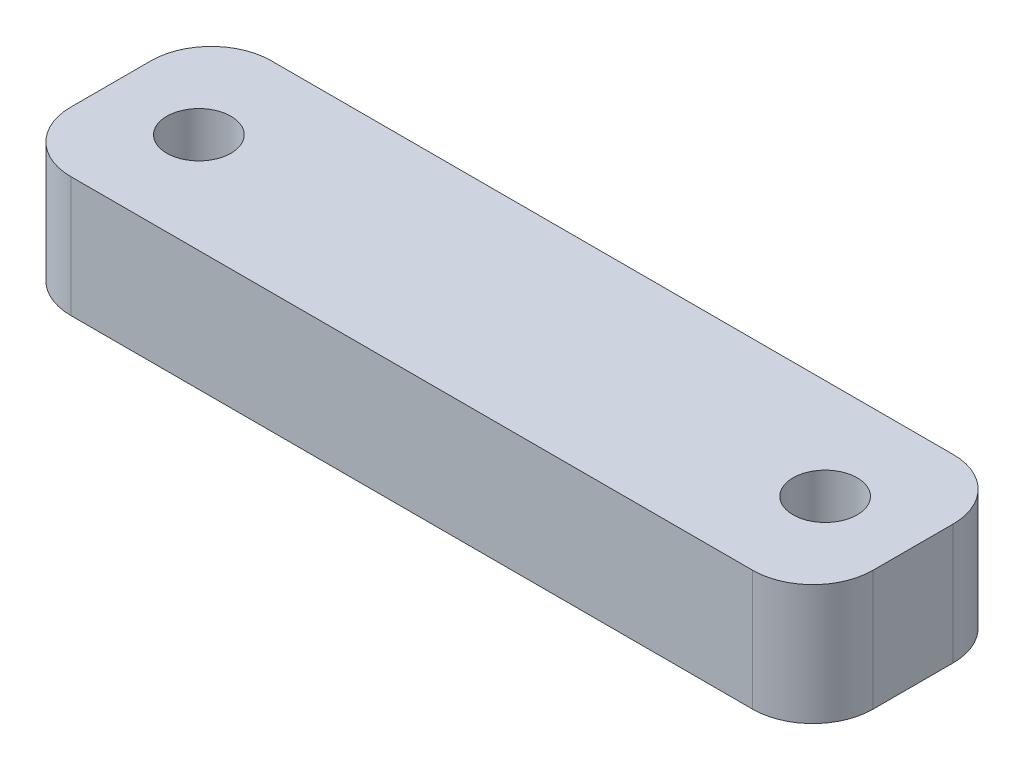
ISO-10303-21;
HEADER;
FILE_DESCRIPTION(('STEP AP214'),'2;1');
FILE_NAME('part.step','',(''),(''),'','','');
FILE_SCHEMA(('AUTOMOTIVE_DESIGN { 1 0 10303 214 1 1 1 1 }'));
ENDSEC;
DATA;
#1=APPLICATION_CONTEXT('core data for automotive mechanical design processes');
#2=APPLICATION_PROTOCOL_DEFINITION('international standard','automotive_design',2000,#1);
#3=PRODUCT_CONTEXT('',#1,'mechanical');
#4=PRODUCT('Part','Part','',(#3));
#5=PRODUCT_RELATED_PRODUCT_CATEGORY('part','',(#4));
#6=PRODUCT_DEFINITION_FORMATION('','',#4);
#7=PRODUCT_DEFINITION_CONTEXT('part definition',#1,'design');
#8=PRODUCT_DEFINITION('design','',#6,#7);
#9=PRODUCT_DEFINITION_SHAPE('','',#8);
#10=(LENGTH_UNIT() NAMED_UNIT(*) SI_UNIT(.MILLI.,.METRE.));
#11=(NAMED_UNIT(*) PLANE_ANGLE_UNIT() SI_UNIT($,.RADIAN.));
#12=(NAMED_UNIT(*) SI_UNIT($,.STERADIAN.) SOLID_ANGLE_UNIT());
#13=UNCERTAINTY_MEASURE_WITH_UNIT(LENGTH_MEASURE(1.E-05),#10,'distance_accuracy_value','');
#14=(GEOMETRIC_REPRESENTATION_CONTEXT(3) GLOBAL_UNCERTAINTY_ASSIGNED_CONTEXT((#13)) GLOBAL_UNIT_ASSIGNED_CONTEXT((#10,
#11,#12)) REPRESENTATION_CONTEXT('',''));
#15=CARTESIAN_POINT('',(0.,0.,0.));
#16=DIRECTION('',(0.,0.,1.));
#17=DIRECTION('',(1.,0.,0.));
#18=AXIS2_PLACEMENT_3D('',#15,#16,#17);
#19=CARTESIAN_POINT('',(20.,6.,5.));
#20=DIRECTION('',(-1.,0.,0.));
#21=DIRECTION('',(0.,0.,1.));
#22=AXIS2_PLACEMENT_3D('',#19,#20,#21);
#23=PLANE('',#22);
#24=DIRECTION('',(0.,0.,-1.));
#25=VECTOR('',#24,1.);
#26=CARTESIAN_POINT('',(20.,6.,5.));
#27=LINE('',#26,#25);
#28=CARTESIAN_POINT('',(20.,6.,2.));
#29=VERTEX_POINT('',#28);
#30=CARTESIAN_POINT('',(20.,6.,-2.));
#31=VERTEX_POINT('',#30);
#32=EDGE_CURVE('E119',#29,#31,#27,.T.);
#33=ORIENTED_EDGE('',*,*,#32,.F.);
#34=DIRECTION('',(0.,-1.,0.));
#35=VECTOR('',#34,1.);
#36=CARTESIAN_POINT('',(20.,6.,2.));
#37=LINE('',#36,#35);
#38=CARTESIAN_POINT('',(20.,0.,2.));
#39=VERTEX_POINT('',#38);
#40=EDGE_CURVE('E104',#29,#39,#37,.T.);
#41=ORIENTED_EDGE('',*,*,#40,.T.);
#42=DIRECTION('',(0.,0.,-1.));
#43=VECTOR('',#42,1.);
#44=CARTESIAN_POINT('',(20.,0.,5.));
#45=LINE('',#44,#43);
#46=CARTESIAN_POINT('',(20.,0.,-2.));
#47=VERTEX_POINT('',#46);
#48=EDGE_CURVE('E116',#39,#47,#45,.T.);
#49=ORIENTED_EDGE('',*,*,#48,.T.);
#50=DIRECTION('',(0.,-1.,0.));
#51=VECTOR('',#50,1.);
#52=CARTESIAN_POINT('',(20.,6.,-2.));
#53=LINE('',#52,#51);
#54=EDGE_CURVE('E121',#47,#31,#53,.F.);
#55=ORIENTED_EDGE('',*,*,#54,.T.);
#56=EDGE_LOOP('',(#33,#41,#49,#55));
#57=FACE_BOUND('',#56,.T.);
#58=ADVANCED_FACE('F34',(#57),#23,.F.);
#59=CARTESIAN_POINT('',(-20.,6.,-5.));
#60=DIRECTION('',(0.,0.,1.));
#61=DIRECTION('',(1.,0.,0.));
#62=AXIS2_PLACEMENT_3D('',#59,#60,#61);
#63=PLANE('',#62);
#64=DIRECTION('',(-1.,0.,0.));
#65=VECTOR('',#64,1.);
#66=CARTESIAN_POINT('',(-20.,0.,-5.));
#67=LINE('',#66,#65);
#68=CARTESIAN_POINT('',(17.,0.,-5.));
#69=VERTEX_POINT('',#68);
#70=CARTESIAN_POINT('',(-17.,0.,-5.));
#71=VERTEX_POINT('',#70);
#72=EDGE_CURVE('E125',#69,#71,#67,.T.);
#73=ORIENTED_EDGE('',*,*,#72,.T.);
#74=DIRECTION('',(0.,-1.,0.));
#75=VECTOR('',#74,1.);
#76=CARTESIAN_POINT('',(-17.,6.,-5.));
#77=LINE('',#76,#75);
#78=CARTESIAN_POINT('',(-17.,6.,-5.));
#79=VERTEX_POINT('',#78);
#80=EDGE_CURVE('E11',#71,#79,#77,.F.);
#81=ORIENTED_EDGE('',*,*,#80,.T.);
#82=DIRECTION('',(-1.,0.,0.));
#83=VECTOR('',#82,1.);
#84=CARTESIAN_POINT('',(-20.,6.,-5.));
#85=LINE('',#84,#83);
#86=CARTESIAN_POINT('',(17.,6.,-5.));
#87=VERTEX_POINT('',#86);
#88=EDGE_CURVE('E165',#87,#79,#85,.T.);
#89=ORIENTED_EDGE('',*,*,#88,.F.);
#90=DIRECTION('',(0.,-1.,0.));
#91=VECTOR('',#90,1.);
#92=CARTESIAN_POINT('',(17.,6.,-5.));
#93=LINE('',#92,#91);
#94=EDGE_CURVE('E42',#87,#69,#93,.T.);
#95=ORIENTED_EDGE('',*,*,#94,.T.);
#96=EDGE_LOOP('',(#73,#81,#89,#95));
#97=FACE_BOUND('',#96,.T.);
#98=ADVANCED_FACE('F163',(#97),#63,.F.);
#99=CARTESIAN_POINT('',(-20.,6.,5.));
#100=DIRECTION('',(1.,0.,0.));
#101=DIRECTION('',(0.,0.,-1.));
#102=AXIS2_PLACEMENT_3D('',#99,#100,#101);
#103=PLANE('',#102);
#104=DIRECTION('',(0.,0.,1.));
#105=VECTOR('',#104,1.);
#106=CARTESIAN_POINT('',(-20.,0.,5.));
#107=LINE('',#106,#105);
#108=CARTESIAN_POINT('',(-20.,0.,-2.));
#109=VERTEX_POINT('',#108);
#110=CARTESIAN_POINT('',(-20.,0.,2.));
#111=VERTEX_POINT('',#110);
#112=EDGE_CURVE('E129',#109,#111,#107,.T.);
#113=ORIENTED_EDGE('',*,*,#112,.T.);
#114=DIRECTION('',(0.,-1.,0.));
#115=VECTOR('',#114,1.);
#116=CARTESIAN_POINT('',(-20.,6.,2.));
#117=LINE('',#116,#115);
#118=CARTESIAN_POINT('',(-20.,6.,2.));
#119=VERTEX_POINT('',#118);
#120=EDGE_CURVE('E49',#111,#119,#117,.F.);
#121=ORIENTED_EDGE('',*,*,#120,.T.);
#122=DIRECTION('',(0.,0.,1.));
#123=VECTOR('',#122,1.);
#124=CARTESIAN_POINT('',(-20.,6.,5.));
#125=LINE('',#124,#123);
#126=CARTESIAN_POINT('',(-20.,6.,-2.));
#127=VERTEX_POINT('',#126);
#128=EDGE_CURVE('E173',#127,#119,#125,.T.);
#129=ORIENTED_EDGE('',*,*,#128,.F.);
#130=DIRECTION('',(0.,-1.,0.));
#131=VECTOR('',#130,1.);
#132=CARTESIAN_POINT('',(-20.,6.,-2.));
#133=LINE('',#132,#131);
#134=EDGE_CURVE('E156',#127,#109,#133,.T.);
#135=ORIENTED_EDGE('',*,*,#134,.T.);
#136=EDGE_LOOP('',(#113,#121,#129,#135));
#137=FACE_BOUND('',#136,.T.);
#138=ADVANCED_FACE('F172',(#137),#103,.F.);
#139=CARTESIAN_POINT('',(-20.,6.,5.));
#140=DIRECTION('',(0.,0.,-1.));
#141=DIRECTION('',(-1.,0.,0.));
#142=AXIS2_PLACEMENT_3D('',#139,#140,#141);
#143=PLANE('',#142);
#144=DIRECTION('',(1.,0.,0.));
#145=VECTOR('',#144,1.);
#146=CARTESIAN_POINT('',(-20.,0.,5.));
#147=LINE('',#146,#145);
#148=CARTESIAN_POINT('',(-17.,0.,5.));
#149=VERTEX_POINT('',#148);
#150=CARTESIAN_POINT('',(17.,0.,5.));
#151=VERTEX_POINT('',#150);
#152=EDGE_CURVE('E139',#149,#151,#147,.T.);
#153=ORIENTED_EDGE('',*,*,#152,.T.);
#154=DIRECTION('',(0.,-1.,0.));
#155=VECTOR('',#154,1.);
#156=CARTESIAN_POINT('',(17.,6.,5.));
#157=LINE('',#156,#155);
#158=CARTESIAN_POINT('',(17.,6.,5.));
#159=VERTEX_POINT('',#158);
#160=EDGE_CURVE('E105',#151,#159,#157,.F.);
#161=ORIENTED_EDGE('',*,*,#160,.T.);
#162=DIRECTION('',(1.,0.,0.));
#163=VECTOR('',#162,1.);
#164=CARTESIAN_POINT('',(-20.,6.,5.));
#165=LINE('',#164,#163);
#166=CARTESIAN_POINT('',(-17.,6.,5.));
#167=VERTEX_POINT('',#166);
#168=EDGE_CURVE('E135',#167,#159,#165,.T.);
#169=ORIENTED_EDGE('',*,*,#168,.F.);
#170=DIRECTION('',(0.,-1.,0.));
#171=VECTOR('',#170,1.);
#172=CARTESIAN_POINT('',(-17.,6.,5.));
#173=LINE('',#172,#171);
#174=EDGE_CURVE('E110',#167,#149,#173,.T.);
#175=ORIENTED_EDGE('',*,*,#174,.T.);
#176=EDGE_LOOP('',(#153,#161,#169,#175));
#177=FACE_BOUND('',#176,.T.);
#178=ADVANCED_FACE('F200',(#177),#143,.F.);
#179=CARTESIAN_POINT('',(0.,6.,0.));
#180=DIRECTION('',(0.,-1.,0.));
#181=DIRECTION('',(0.,0.,-1.));
#182=AXIS2_PLACEMENT_3D('',#179,#180,#181);
#183=PLANE('',#182);
#184=CARTESIAN_POINT('',(-15.612495,6.,0.));
#185=DIRECTION('',(0.,1.,0.));
#186=DIRECTION('',(0.,0.,1.));
#187=AXIS2_PLACEMENT_3D('',#184,#185,#186);
#188=CIRCLE('',#187,1.6);
#189=CARTESIAN_POINT('',(-15.612495,6.,1.6));
#190=VERTEX_POINT('',#189);
#191=EDGE_CURVE('E126',#190,#190,#188,.T.);
#192=ORIENTED_EDGE('',*,*,#191,.F.);
#193=EDGE_LOOP('',(#192));
#194=FACE_BOUND('',#193,.T.);
#195=CARTESIAN_POINT('',(15.612495,6.,0.));
#196=DIRECTION('',(0.,1.,0.));
#197=DIRECTION('',(0.,0.,-1.));
#198=AXIS2_PLACEMENT_3D('',#195,#196,#197);
#199=CIRCLE('',#198,1.60000000000001);
#200=CARTESIAN_POINT('',(15.612495,6.,1.6));
#201=VERTEX_POINT('',#200);
#202=EDGE_CURVE('E182',#201,#201,#199,.T.);
#203=ORIENTED_EDGE('',*,*,#202,.F.);
#204=EDGE_LOOP('',(#203));
#205=FACE_BOUND('',#204,.T.);
#206=ORIENTED_EDGE('',*,*,#168,.T.);
#207=CARTESIAN_POINT('',(17.,6.,2.));
#208=DIRECTION('',(0.,-1.,0.));
#209=DIRECTION('',(0.,0.,-1.));
#210=AXIS2_PLACEMENT_3D('',#207,#208,#209);
#211=CIRCLE('',#210,3.);
#212=EDGE_CURVE('E154',#159,#29,#211,.F.);
#213=ORIENTED_EDGE('',*,*,#212,.T.);
#214=ORIENTED_EDGE('',*,*,#32,.T.);
#215=CARTESIAN_POINT('',(17.,6.,-2.));
#216=DIRECTION('',(0.,-1.,0.));
#217=DIRECTION('',(0.,0.,-1.));
#218=AXIS2_PLACEMENT_3D('',#215,#216,#217);
#219=CIRCLE('',#218,3.);
#220=EDGE_CURVE('E149',#31,#87,#219,.F.);
#221=ORIENTED_EDGE('',*,*,#220,.T.);
#222=ORIENTED_EDGE('',*,*,#88,.T.);
#223=CARTESIAN_POINT('',(-17.,6.,-2.));
#224=DIRECTION('',(0.,-1.,0.));
#225=DIRECTION('',(0.,0.,-1.));
#226=AXIS2_PLACEMENT_3D('',#223,#224,#225);
#227=CIRCLE('',#226,3.);
#228=EDGE_CURVE('E56',#79,#127,#227,.F.);
#229=ORIENTED_EDGE('',*,*,#228,.T.);
#230=ORIENTED_EDGE('',*,*,#128,.T.);
#231=CARTESIAN_POINT('',(-17.,6.,2.));
#232=DIRECTION('',(0.,-1.,0.));
#233=DIRECTION('',(0.,0.,-1.));
#234=AXIS2_PLACEMENT_3D('',#231,#232,#233);
#235=CIRCLE('',#234,3.);
#236=EDGE_CURVE('E152',#119,#167,#235,.F.);
#237=ORIENTED_EDGE('',*,*,#236,.T.);
#238=EDGE_LOOP('',(#206,#213,#214,#221,#222,#229,#230,#237));
#239=FACE_BOUND('',#238,.T.);
#240=ADVANCED_FACE('F197',(#194,#205,#239),#183,.F.);
#241=CARTESIAN_POINT('',(0.,0.,0.));
#242=DIRECTION('',(0.,-1.,0.));
#243=DIRECTION('',(0.,0.,-1.));
#244=AXIS2_PLACEMENT_3D('',#241,#242,#243);
#245=PLANE('',#244);
#246=CARTESIAN_POINT('',(-15.612495,0.,0.));
#247=DIRECTION('',(0.,-1.,0.));
#248=DIRECTION('',(0.,0.,-1.));
#249=AXIS2_PLACEMENT_3D('',#246,#247,#248);
#250=CIRCLE('',#249,1.6);
#251=CARTESIAN_POINT('',(-15.612495,0.,1.6));
#252=VERTEX_POINT('',#251);
#253=EDGE_CURVE('E132',#252,#252,#250,.F.);
#254=ORIENTED_EDGE('',*,*,#253,.T.);
#255=EDGE_LOOP('',(#254));
#256=FACE_BOUND('',#255,.T.);
#257=CARTESIAN_POINT('',(15.612495,0.,0.));
#258=DIRECTION('',(0.,-1.,0.));
#259=DIRECTION('',(0.,0.,-1.));
#260=AXIS2_PLACEMENT_3D('',#257,#258,#259);
#261=CIRCLE('',#260,1.60000000000001);
#262=CARTESIAN_POINT('',(15.612495,0.,1.6));
#263=VERTEX_POINT('',#262);
#264=EDGE_CURVE('E179',#263,#263,#261,.F.);
#265=ORIENTED_EDGE('',*,*,#264,.T.);
#266=EDGE_LOOP('',(#265));
#267=FACE_BOUND('',#266,.T.);
#268=ORIENTED_EDGE('',*,*,#48,.F.);
#269=CARTESIAN_POINT('',(17.,0.,2.));
#270=DIRECTION('',(0.,-1.,0.));
#271=DIRECTION('',(0.,0.,-1.));
#272=AXIS2_PLACEMENT_3D('',#269,#270,#271);
#273=CIRCLE('',#272,3.);
#274=EDGE_CURVE('E100',#39,#151,#273,.T.);
#275=ORIENTED_EDGE('',*,*,#274,.T.);
#276=ORIENTED_EDGE('',*,*,#152,.F.);
#277=CARTESIAN_POINT('',(-17.,0.,2.));
#278=DIRECTION('',(0.,-1.,0.));
#279=DIRECTION('',(0.,0.,-1.));
#280=AXIS2_PLACEMENT_3D('',#277,#278,#279);
#281=CIRCLE('',#280,3.);
#282=EDGE_CURVE('E111',#149,#111,#281,.T.);
#283=ORIENTED_EDGE('',*,*,#282,.T.);
#284=ORIENTED_EDGE('',*,*,#112,.F.);
#285=CARTESIAN_POINT('',(-17.,0.,-2.));
#286=DIRECTION('',(0.,-1.,0.));
#287=DIRECTION('',(0.,0.,-1.));
#288=AXIS2_PLACEMENT_3D('',#285,#286,#287);
#289=CIRCLE('',#288,3.);
#290=EDGE_CURVE('E143',#109,#71,#289,.T.);
#291=ORIENTED_EDGE('',*,*,#290,.T.);
#292=ORIENTED_EDGE('',*,*,#72,.F.);
#293=CARTESIAN_POINT('',(17.,0.,-2.));
#294=DIRECTION('',(0.,-1.,0.));
#295=DIRECTION('',(0.,0.,-1.));
#296=AXIS2_PLACEMENT_3D('',#293,#294,#295);
#297=CIRCLE('',#296,3.);
#298=EDGE_CURVE('E120',#69,#47,#297,.T.);
#299=ORIENTED_EDGE('',*,*,#298,.T.);
#300=EDGE_LOOP('',(#268,#275,#276,#283,#284,#291,#292,#299));
#301=FACE_BOUND('',#300,.T.);
#302=ADVANCED_FACE('F123',(#256,#267,#301),#245,.T.);
#303=CARTESIAN_POINT('',(15.612495,-0.00100000000000013,0.));
#304=DIRECTION('',(0.,1.,0.));
#305=DIRECTION('',(0.,0.,1.));
#306=AXIS2_PLACEMENT_3D('',#303,#304,#305);
#307=CYLINDRICAL_SURFACE('',#306,1.60000000000001);
#308=CARTESIAN_POINT('',(15.612495,0.,1.6));
#309=CARTESIAN_POINT('',(15.612495,0.0624999999999999,1.6));
#310=CARTESIAN_POINT('',(15.612495,0.125,1.6));
#311=CARTESIAN_POINT('',(15.612495,0.25,1.6));
#312=CARTESIAN_POINT('',(15.612495,0.3125,1.6));
#313=CARTESIAN_POINT('',(15.612495,0.4375,1.6));
#314=CARTESIAN_POINT('',(15.612495,0.5,1.6));
#315=CARTESIAN_POINT('',(15.612495,0.625,1.6));
#316=CARTESIAN_POINT('',(15.612495,0.6875,1.6));
#317=CARTESIAN_POINT('',(15.612495,0.8125,1.6));
#318=CARTESIAN_POINT('',(15.612495,0.875,1.6));
#319=CARTESIAN_POINT('',(15.612495,1.,1.6));
#320=CARTESIAN_POINT('',(15.612495,1.0625,1.6));
#321=CARTESIAN_POINT('',(15.612495,1.1875,1.6));
#322=CARTESIAN_POINT('',(15.612495,1.25,1.6));
#323=CARTESIAN_POINT('',(15.612495,1.375,1.6));
#324=CARTESIAN_POINT('',(15.612495,1.4375,1.6));
#325=CARTESIAN_POINT('',(15.612495,1.5625,1.6));
#326=CARTESIAN_POINT('',(15.612495,1.625,1.6));
#327=CARTESIAN_POINT('',(15.612495,1.75,1.6));
#328=CARTESIAN_POINT('',(15.612495,1.8125,1.6));
#329=CARTESIAN_POINT('',(15.612495,1.9375,1.6));
#330=CARTESIAN_POINT('',(15.612495,2.,1.6));
#331=CARTESIAN_POINT('',(15.612495,2.125,1.6));
#332=CARTESIAN_POINT('',(15.612495,2.1875,1.6));
#333=CARTESIAN_POINT('',(15.612495,2.3125,1.6));
#334=CARTESIAN_POINT('',(15.612495,2.375,1.6));
#335=CARTESIAN_POINT('',(15.612495,2.5,1.6));
#336=CARTESIAN_POINT('',(15.612495,2.5625,1.6));
#337=CARTESIAN_POINT('',(15.612495,2.6875,1.6));
#338=CARTESIAN_POINT('',(15.612495,2.75,1.6));
#339=CARTESIAN_POINT('',(15.612495,2.875,1.6));
#340=CARTESIAN_POINT('',(15.612495,2.9375,1.6));
#341=CARTESIAN_POINT('',(15.612495,3.0625,1.6));
#342=CARTESIAN_POINT('',(15.612495,3.125,1.6));
#343=CARTESIAN_POINT('',(15.612495,3.25,1.6));
#344=CARTESIAN_POINT('',(15.612495,3.3125,1.6));
#345=CARTESIAN_POINT('',(15.612495,3.4375,1.6));
#346=CARTESIAN_POINT('',(15.612495,3.5,1.6));
#347=CARTESIAN_POINT('',(15.612495,3.625,1.6));
#348=CARTESIAN_POINT('',(15.612495,3.6875,1.6));
#349=CARTESIAN_POINT('',(15.612495,3.8125,1.6));
#350=CARTESIAN_POINT('',(15.612495,3.875,1.6));
#351=CARTESIAN_POINT('',(15.612495,4.,1.6));
#352=CARTESIAN_POINT('',(15.612495,4.0625,1.6));
#353=CARTESIAN_POINT('',(15.612495,4.1875,1.6));
#354=CARTESIAN_POINT('',(15.612495,4.25,1.6));
#355=CARTESIAN_POINT('',(15.612495,4.375,1.6));
#356=CARTESIAN_POINT('',(15.612495,4.4375,1.6));
#357=CARTESIAN_POINT('',(15.612495,4.5625,1.6));
#358=CARTESIAN_POINT('',(15.612495,4.625,1.6));
#359=CARTESIAN_POINT('',(15.612495,4.75,1.6));
#360=CARTESIAN_POINT('',(15.612495,4.8125,1.6));
#361=CARTESIAN_POINT('',(15.612495,4.9375,1.6));
#362=CARTESIAN_POINT('',(15.612495,5.,1.6));
#363=CARTESIAN_POINT('',(15.612495,5.125,1.6));
#364=CARTESIAN_POINT('',(15.612495,5.1875,1.6));
#365=CARTESIAN_POINT('',(15.612495,5.3125,1.6));
#366=CARTESIAN_POINT('',(15.612495,5.375,1.6));
#367=CARTESIAN_POINT('',(15.612495,5.5,1.6));
#368=CARTESIAN_POINT('',(15.612495,5.5625,1.6));
#369=CARTESIAN_POINT('',(15.612495,5.6875,1.6));
#370=CARTESIAN_POINT('',(15.612495,5.75,1.6));
#371=CARTESIAN_POINT('',(15.612495,5.875,1.6));
#372=CARTESIAN_POINT('',(15.612495,5.9375,1.6));
#373=CARTESIAN_POINT('',(15.612495,6.,1.6));
#374=B_SPLINE_CURVE_WITH_KNOTS('',3,(#308,#309,#310,#311,#312,#313,#314,#315,#316,#317,#318,
#319,#320,#321,#322,#323,#324,#325,#326,#327,#328,#329,#330,#331,#332,#333,#334,#335,#336,#337,
#338,#339,#340,#341,#342,#343,#344,#345,#346,#347,#348,#349,#350,#351,#352,#353,#354,#355,#356,
#357,#358,#359,#360,#361,#362,#363,#364,#365,#366,#367,#368,#369,#370,#371,#372,#373),
.UNSPECIFIED.,.F.,.F.,(4,2,2,2,2,2,2,2,2,2,2,2,2,2,2,2,2,2,2,2,2,2,2,2,2,2,2,2,2,2,2,2,4),(0.,
0.1875,0.375,0.5625,0.75,0.9375,1.125,1.3125,1.5,1.6875,1.875,2.0625,2.25,2.4375,2.625,2.8125,
3.,3.1875,3.375,3.5625,3.75,3.9375,4.125,4.3125,4.5,4.6875,4.875,5.0625,5.25,5.4375,5.625,
5.8125,6.),.UNSPECIFIED.);
#375=EDGE_CURVE('BSEAM193',#263,#201,#374,.T.);
#376=ORIENTED_EDGE('',*,*,#264,.F.);
#377=ORIENTED_EDGE('',*,*,#202,.T.);
#378=ORIENTED_EDGE('',*,*,#375,.T.);
#379=ORIENTED_EDGE('',*,*,#375,.F.);
#380=EDGE_LOOP('',(#376,#378,#377,#379));
#381=FACE_BOUND('',#380,.T.);
#382=ADVANCED_FACE('F193',(#381),#307,.F.);
#383=CARTESIAN_POINT('',(-15.612495,-0.00100000000000013,0.));
#384=DIRECTION('',(0.,1.,0.));
#385=DIRECTION('',(0.,0.,1.));
#386=AXIS2_PLACEMENT_3D('',#383,#384,#385);
#387=CYLINDRICAL_SURFACE('',#386,1.6);
#388=CARTESIAN_POINT('',(-15.612495,0.,1.6));
#389=CARTESIAN_POINT('',(-15.612495,0.0624999999999999,1.6));
#390=CARTESIAN_POINT('',(-15.612495,0.125,1.6));
#391=CARTESIAN_POINT('',(-15.612495,0.25,1.6));
#392=CARTESIAN_POINT('',(-15.612495,0.3125,1.6));
#393=CARTESIAN_POINT('',(-15.612495,0.4375,1.6));
#394=CARTESIAN_POINT('',(-15.612495,0.5,1.6));
#395=CARTESIAN_POINT('',(-15.612495,0.625,1.6));
#396=CARTESIAN_POINT('',(-15.612495,0.6875,1.6));
#397=CARTESIAN_POINT('',(-15.612495,0.8125,1.6));
#398=CARTESIAN_POINT('',(-15.612495,0.875,1.6));
#399=CARTESIAN_POINT('',(-15.612495,1.,1.6));
#400=CARTESIAN_POINT('',(-15.612495,1.0625,1.6));
#401=CARTESIAN_POINT('',(-15.612495,1.1875,1.6));
#402=CARTESIAN_POINT('',(-15.612495,1.25,1.6));
#403=CARTESIAN_POINT('',(-15.612495,1.375,1.6));
#404=CARTESIAN_POINT('',(-15.612495,1.4375,1.6));
#405=CARTESIAN_POINT('',(-15.612495,1.5625,1.6));
#406=CARTESIAN_POINT('',(-15.612495,1.625,1.6));
#407=CARTESIAN_POINT('',(-15.612495,1.75,1.6));
#408=CARTESIAN_POINT('',(-15.612495,1.8125,1.6));
#409=CARTESIAN_POINT('',(-15.612495,1.9375,1.6));
#410=CARTESIAN_POINT('',(-15.612495,2.,1.6));
#411=CARTESIAN_POINT('',(-15.612495,2.125,1.6));
#412=CARTESIAN_POINT('',(-15.612495,2.1875,1.6));
#413=CARTESIAN_POINT('',(-15.612495,2.3125,1.6));
#414=CARTESIAN_POINT('',(-15.612495,2.375,1.6));
#415=CARTESIAN_POINT('',(-15.612495,2.5,1.6));
#416=CARTESIAN_POINT('',(-15.612495,2.5625,1.6));
#417=CARTESIAN_POINT('',(-15.612495,2.6875,1.6));
#418=CARTESIAN_POINT('',(-15.612495,2.75,1.6));
#419=CARTESIAN_POINT('',(-15.612495,2.875,1.6));
#420=CARTESIAN_POINT('',(-15.612495,2.9375,1.6));
#421=CARTESIAN_POINT('',(-15.612495,3.0625,1.6));
#422=CARTESIAN_POINT('',(-15.612495,3.125,1.6));
#423=CARTESIAN_POINT('',(-15.612495,3.25,1.6));
#424=CARTESIAN_POINT('',(-15.612495,3.3125,1.6));
#425=CARTESIAN_POINT('',(-15.612495,3.4375,1.6));
#426=CARTESIAN_POINT('',(-15.612495,3.5,1.6));
#427=CARTESIAN_POINT('',(-15.612495,3.625,1.6));
#428=CARTESIAN_POINT('',(-15.612495,3.6875,1.6));
#429=CARTESIAN_POINT('',(-15.612495,3.8125,1.6));
#430=CARTESIAN_POINT('',(-15.612495,3.875,1.6));
#431=CARTESIAN_POINT('',(-15.612495,4.,1.6));
#432=CARTESIAN_POINT('',(-15.612495,4.0625,1.6));
#433=CARTESIAN_POINT('',(-15.612495,4.1875,1.6));
#434=CARTESIAN_POINT('',(-15.612495,4.25,1.6));
#435=CARTESIAN_POINT('',(-15.612495,4.375,1.6));
#436=CARTESIAN_POINT('',(-15.612495,4.4375,1.6));
#437=CARTESIAN_POINT('',(-15.612495,4.5625,1.6));
#438=CARTESIAN_POINT('',(-15.612495,4.625,1.6));
#439=CARTESIAN_POINT('',(-15.612495,4.75,1.6));
#440=CARTESIAN_POINT('',(-15.612495,4.8125,1.6));
#441=CARTESIAN_POINT('',(-15.612495,4.9375,1.6));
#442=CARTESIAN_POINT('',(-15.612495,5.,1.6));
#443=CARTESIAN_POINT('',(-15.612495,5.125,1.6));
#444=CARTESIAN_POINT('',(-15.612495,5.1875,1.6));
#445=CARTESIAN_POINT('',(-15.612495,5.3125,1.6));
#446=CARTESIAN_POINT('',(-15.612495,5.375,1.6));
#447=CARTESIAN_POINT('',(-15.612495,5.5,1.6));
#448=CARTESIAN_POINT('',(-15.612495,5.5625,1.6));
#449=CARTESIAN_POINT('',(-15.612495,5.6875,1.6));
#450=CARTESIAN_POINT('',(-15.612495,5.75,1.6));
#451=CARTESIAN_POINT('',(-15.612495,5.875,1.6));
#452=CARTESIAN_POINT('',(-15.612495,5.9375,1.6));
#453=CARTESIAN_POINT('',(-15.612495,6.,1.6));
#454=B_SPLINE_CURVE_WITH_KNOTS('',3,(#388,#389,#390,#391,#392,#393,#394,#395,#396,#397,#398,
#399,#400,#401,#402,#403,#404,#405,#406,#407,#408,#409,#410,#411,#412,#413,#414,#415,#416,#417,
#418,#419,#420,#421,#422,#423,#424,#425,#426,#427,#428,#429,#430,#431,#432,#433,#434,#435,#436,
#437,#438,#439,#440,#441,#442,#443,#444,#445,#446,#447,#448,#449,#450,#451,#452,#453),
.UNSPECIFIED.,.F.,.F.,(4,2,2,2,2,2,2,2,2,2,2,2,2,2,2,2,2,2,2,2,2,2,2,2,2,2,2,2,2,2,2,2,4),(0.,
0.1875,0.375,0.5625,0.75,0.9375,1.125,1.3125,1.5,1.6875,1.875,2.0625,2.25,2.4375,2.625,2.8125,
3.,3.1875,3.375,3.5625,3.75,3.9375,4.125,4.3125,4.5,4.6875,4.875,5.0625,5.25,5.4375,5.625,
5.8125,6.),.UNSPECIFIED.);
#455=EDGE_CURVE('BSEAM190',#252,#190,#454,.T.);
#456=ORIENTED_EDGE('',*,*,#253,.F.);
#457=ORIENTED_EDGE('',*,*,#191,.T.);
#458=ORIENTED_EDGE('',*,*,#455,.T.);
#459=ORIENTED_EDGE('',*,*,#455,.F.);
#460=EDGE_LOOP('',(#456,#458,#457,#459));
#461=FACE_BOUND('',#460,.T.);
#462=ADVANCED_FACE('F190',(#461),#387,.F.);
#463=CARTESIAN_POINT('',(17.,6.,2.));
#464=DIRECTION('',(0.,-1.,0.));
#465=DIRECTION('',(0.,0.,-1.));
#466=AXIS2_PLACEMENT_3D('',#463,#464,#465);
#467=CYLINDRICAL_SURFACE('',#466,3.);
#468=ORIENTED_EDGE('',*,*,#212,.F.);
#469=ORIENTED_EDGE('',*,*,#160,.F.);
#470=ORIENTED_EDGE('',*,*,#274,.F.);
#471=ORIENTED_EDGE('',*,*,#40,.F.);
#472=EDGE_LOOP('',(#468,#469,#470,#471));
#473=FACE_BOUND('',#472,.T.);
#474=ADVANCED_FACE('F103',(#473),#467,.T.);
#475=CARTESIAN_POINT('',(-17.,6.,2.));
#476=DIRECTION('',(0.,-1.,0.));
#477=DIRECTION('',(0.,0.,-1.));
#478=AXIS2_PLACEMENT_3D('',#475,#476,#477);
#479=CYLINDRICAL_SURFACE('',#478,3.);
#480=ORIENTED_EDGE('',*,*,#236,.F.);
#481=ORIENTED_EDGE('',*,*,#120,.F.);
#482=ORIENTED_EDGE('',*,*,#282,.F.);
#483=ORIENTED_EDGE('',*,*,#174,.F.);
#484=EDGE_LOOP('',(#480,#481,#482,#483));
#485=FACE_BOUND('',#484,.T.);
#486=ADVANCED_FACE('F207',(#485),#479,.T.);
#487=CARTESIAN_POINT('',(-17.,6.,-2.));
#488=DIRECTION('',(0.,-1.,0.));
#489=DIRECTION('',(0.,0.,-1.));
#490=AXIS2_PLACEMENT_3D('',#487,#488,#489);
#491=CYLINDRICAL_SURFACE('',#490,3.);
#492=ORIENTED_EDGE('',*,*,#228,.F.);
#493=ORIENTED_EDGE('',*,*,#80,.F.);
#494=ORIENTED_EDGE('',*,*,#290,.F.);
#495=ORIENTED_EDGE('',*,*,#134,.F.);
#496=EDGE_LOOP('',(#492,#493,#494,#495));
#497=FACE_BOUND('',#496,.T.);
#498=ADVANCED_FACE('F171',(#497),#491,.T.);
#499=CARTESIAN_POINT('',(17.,6.,-2.));
#500=DIRECTION('',(0.,-1.,0.));
#501=DIRECTION('',(0.,0.,-1.));
#502=AXIS2_PLACEMENT_3D('',#499,#500,#501);
#503=CYLINDRICAL_SURFACE('',#502,3.);
#504=ORIENTED_EDGE('',*,*,#220,.F.);
#505=ORIENTED_EDGE('',*,*,#54,.F.);
#506=ORIENTED_EDGE('',*,*,#298,.F.);
#507=ORIENTED_EDGE('',*,*,#94,.F.);
#508=EDGE_LOOP('',(#504,#505,#506,#507));
#509=FACE_BOUND('',#508,.T.);
#510=ADVANCED_FACE('F36',(#509),#503,.T.);
#511=CLOSED_SHELL('',(#58,#98,#138,#178,#240,#302,#382,#462,#474,#486,#498,#510));
#512=MANIFOLD_SOLID_BREP('B2',#511);
#513=ADVANCED_BREP_SHAPE_REPRESENTATION('',(#18,#512),#14);
#514=SHAPE_DEFINITION_REPRESENTATION(#9,#513);
ENDSEC;
END-ISO-10303-21;
